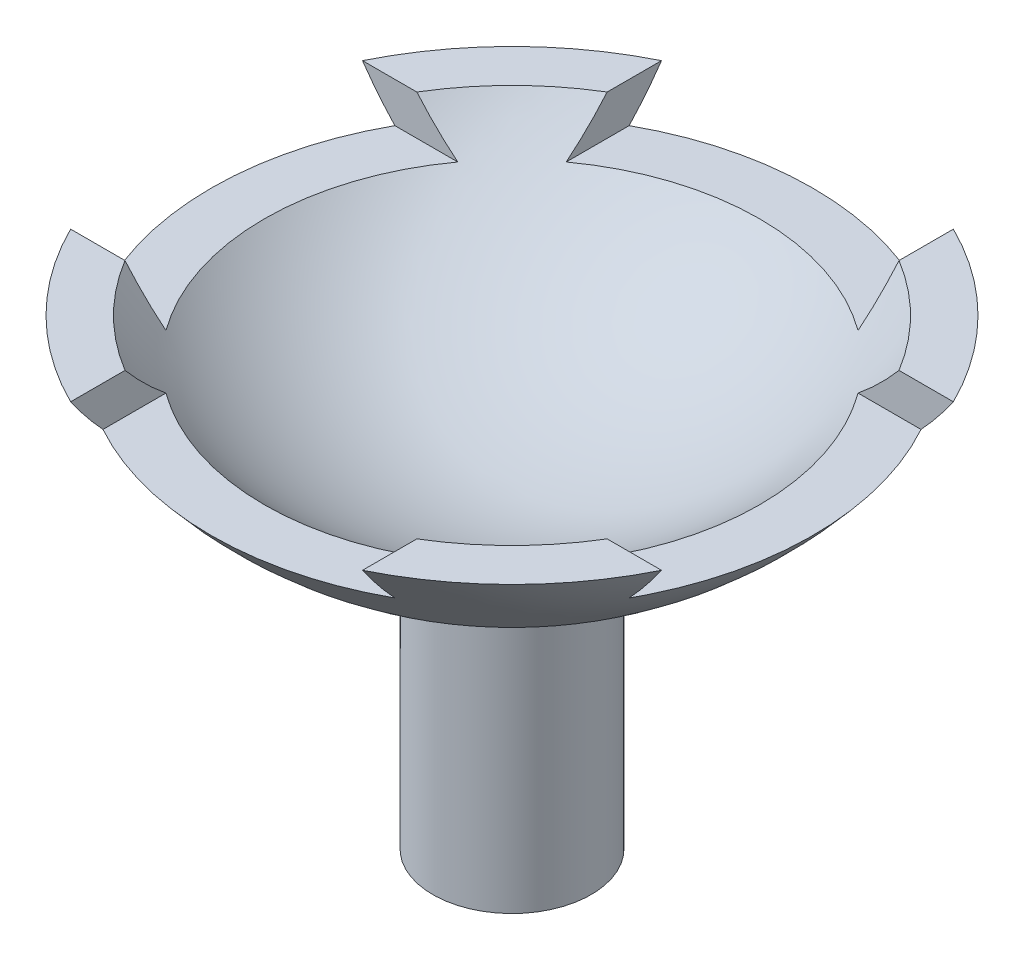
ISO-10303-21;
HEADER;
FILE_DESCRIPTION(('STEP AP214'),'2;1');
FILE_NAME('part.step','',(''),(''),'','','');
FILE_SCHEMA(('AUTOMOTIVE_DESIGN { 1 0 10303 214 1 1 1 1 }'));
ENDSEC;
DATA;
#1=APPLICATION_CONTEXT('core data for automotive mechanical design processes');
#2=APPLICATION_PROTOCOL_DEFINITION('international standard','automotive_design',2000,#1);
#3=PRODUCT_CONTEXT('',#1,'mechanical');
#4=PRODUCT('Part','Part','',(#3));
#5=PRODUCT_RELATED_PRODUCT_CATEGORY('part','',(#4));
#6=PRODUCT_DEFINITION_FORMATION('','',#4);
#7=PRODUCT_DEFINITION_CONTEXT('part definition',#1,'design');
#8=PRODUCT_DEFINITION('design','',#6,#7);
#9=PRODUCT_DEFINITION_SHAPE('','',#8);
#10=(LENGTH_UNIT() NAMED_UNIT(*) SI_UNIT(.MILLI.,.METRE.));
#11=(NAMED_UNIT(*) PLANE_ANGLE_UNIT() SI_UNIT($,.RADIAN.));
#12=(NAMED_UNIT(*) SI_UNIT($,.STERADIAN.) SOLID_ANGLE_UNIT());
#13=UNCERTAINTY_MEASURE_WITH_UNIT(LENGTH_MEASURE(1.E-05),#10,'distance_accuracy_value','');
#14=(GEOMETRIC_REPRESENTATION_CONTEXT(3) GLOBAL_UNCERTAINTY_ASSIGNED_CONTEXT((#13)) GLOBAL_UNIT_ASSIGNED_CONTEXT((#10,
#11,#12)) REPRESENTATION_CONTEXT('',''));
#15=CARTESIAN_POINT('',(0.,0.,0.));
#16=DIRECTION('',(0.,0.,1.));
#17=DIRECTION('',(1.,0.,0.));
#18=AXIS2_PLACEMENT_3D('',#15,#16,#17);
#19=CARTESIAN_POINT('',(21.3480786758773,35.,0.));
#20=DIRECTION('',(0.,-1.,0.));
#21=DIRECTION('',(1.,0.,0.));
#22=AXIS2_PLACEMENT_3D('',#19,#20,#21);
#23=PLANE('',#22);
#24=CARTESIAN_POINT('',(0.,35.,0.));
#25=DIRECTION('',(0.,1.,0.));
#26=DIRECTION('',(-1.,0.,0.));
#27=AXIS2_PLACEMENT_3D('',#24,#25,#26);
#28=CIRCLE('',#27,21.3480786758774);
#29=CARTESIAN_POINT('',(-18.2627335892371,35.,11.055));
#30=VERTEX_POINT('',#29);
#31=CARTESIAN_POINT('',(-11.055,35.,18.2627335892371));
#32=VERTEX_POINT('',#31);
#33=EDGE_CURVE('E268',#30,#32,#28,.T.);
#34=ORIENTED_EDGE('',*,*,#33,.F.);
#35=DIRECTION('',(1.,0.,0.));
#36=VECTOR('',#35,1.);
#37=CARTESIAN_POINT('',(-24.9637815587817,35.,11.0550000000001));
#38=LINE('',#37,#36);
#39=CARTESIAN_POINT('',(-22.3814083147475,35.,11.0550000000001));
#40=VERTEX_POINT('',#39);
#41=EDGE_CURVE('E171',#40,#30,#38,.T.);
#42=ORIENTED_EDGE('',*,*,#41,.F.);
#43=CARTESIAN_POINT('',(0.,35.,0.));
#44=DIRECTION('',(0.,1.,0.));
#45=DIRECTION('',(-1.,0.,0.));
#46=AXIS2_PLACEMENT_3D('',#43,#44,#45);
#47=CIRCLE('',#46,24.9627815587816);
#48=CARTESIAN_POINT('',(-11.055,35.,22.3814083147475));
#49=VERTEX_POINT('',#48);
#50=EDGE_CURVE('E177',#40,#49,#47,.T.);
#51=ORIENTED_EDGE('',*,*,#50,.T.);
#52=DIRECTION('',(0.,0.,-1.));
#53=VECTOR('',#52,1.);
#54=CARTESIAN_POINT('',(-11.055,35.,24.9637815587816));
#55=LINE('',#54,#53);
#56=EDGE_CURVE('E207',#49,#32,#55,.T.);
#57=ORIENTED_EDGE('',*,*,#56,.T.);
#58=EDGE_LOOP('',(#34,#42,#51,#57));
#59=FACE_BOUND('',#58,.T.);
#60=ADVANCED_FACE('F39',(#59),#23,.F.);
#61=CARTESIAN_POINT('',(11.055,35.,18.2627335892371));
#62=VERTEX_POINT('',#61);
#63=CARTESIAN_POINT('',(18.2627335892372,35.,11.0549999999998));
#64=VERTEX_POINT('',#63);
#65=EDGE_CURVE('E325',#62,#64,#28,.T.);
#66=ORIENTED_EDGE('',*,*,#65,.F.);
#67=DIRECTION('',(0.,0.,-1.));
#68=VECTOR('',#67,1.);
#69=CARTESIAN_POINT('',(11.055,35.,24.9637815587816));
#70=LINE('',#69,#68);
#71=CARTESIAN_POINT('',(11.055,35.,22.3814083147475));
#72=VERTEX_POINT('',#71);
#73=EDGE_CURVE('E204',#72,#62,#70,.T.);
#74=ORIENTED_EDGE('',*,*,#73,.F.);
#75=CARTESIAN_POINT('',(22.3814083147476,35.,11.0549999999998));
#76=VERTEX_POINT('',#75);
#77=EDGE_CURVE('E340',#72,#76,#47,.T.);
#78=ORIENTED_EDGE('',*,*,#77,.T.);
#79=DIRECTION('',(-1.,0.,0.));
#80=VECTOR('',#79,1.);
#81=CARTESIAN_POINT('',(24.963781558782,35.,11.0549999999998));
#82=LINE('',#81,#80);
#83=EDGE_CURVE('E229',#76,#64,#82,.T.);
#84=ORIENTED_EDGE('',*,*,#83,.T.);
#85=EDGE_LOOP('',(#66,#74,#78,#84));
#86=FACE_BOUND('',#85,.T.);
#87=ADVANCED_FACE('F288',(#86),#23,.F.);
#88=CARTESIAN_POINT('',(18.262733589237,35.,-11.0550000000002));
#89=VERTEX_POINT('',#88);
#90=CARTESIAN_POINT('',(11.055,35.,-18.2627335892371));
#91=VERTEX_POINT('',#90);
#92=EDGE_CURVE('E263',#89,#91,#28,.T.);
#93=ORIENTED_EDGE('',*,*,#92,.F.);
#94=DIRECTION('',(-1.,0.,0.));
#95=VECTOR('',#94,1.);
#96=CARTESIAN_POINT('',(24.9637815587818,35.,-11.0550000000002));
#97=LINE('',#96,#95);
#98=CARTESIAN_POINT('',(22.3814083147474,35.,-11.0550000000002));
#99=VERTEX_POINT('',#98);
#100=EDGE_CURVE('E226',#99,#89,#97,.T.);
#101=ORIENTED_EDGE('',*,*,#100,.F.);
#102=CARTESIAN_POINT('',(11.055,35.,-22.3814083147475));
#103=VERTEX_POINT('',#102);
#104=EDGE_CURVE('E267',#99,#103,#47,.T.);
#105=ORIENTED_EDGE('',*,*,#104,.T.);
#106=DIRECTION('',(0.,0.,1.));
#107=VECTOR('',#106,1.);
#108=CARTESIAN_POINT('',(11.055,35.,-24.9637815587816));
#109=LINE('',#108,#107);
#110=EDGE_CURVE('E252',#103,#91,#109,.T.);
#111=ORIENTED_EDGE('',*,*,#110,.T.);
#112=EDGE_LOOP('',(#93,#101,#105,#111));
#113=FACE_BOUND('',#112,.T.);
#114=ADVANCED_FACE('F296',(#113),#23,.F.);
#115=CARTESIAN_POINT('',(0.,50.5312438925075,0.));
#116=DIRECTION('',(0.,1.,0.));
#117=DIRECTION('',(1.,0.,0.));
#118=AXIS2_PLACEMENT_3D('',#115,#116,#117);
#119=SPHERICAL_SURFACE('',#118,26.4);
#120=CARTESIAN_POINT('',(0.,31.96,0.));
#121=DIRECTION('',(0.,-1.,0.));
#122=DIRECTION('',(1.,0.,0.));
#123=AXIS2_PLACEMENT_3D('',#120,#121,#122);
#124=CIRCLE('',#123,18.7634991482134);
#125=CARTESIAN_POINT('',(-15.1609984923488,31.96,11.055));
#126=VERTEX_POINT('',#125);
#127=CARTESIAN_POINT('',(-15.1609984923489,31.96,-11.055));
#128=VERTEX_POINT('',#127);
#129=EDGE_CURVE('E170',#126,#128,#124,.T.);
#130=ORIENTED_EDGE('',*,*,#129,.F.);
#131=CARTESIAN_POINT('',(0.,50.5312438925075,11.055));
#132=DIRECTION('',(0.,0.,1.));
#133=DIRECTION('',(1.,0.,0.));
#134=AXIS2_PLACEMENT_3D('',#131,#132,#133);
#135=CIRCLE('',#134,23.9738811000639);
#136=EDGE_CURVE('E158',#30,#126,#135,.T.);
#137=ORIENTED_EDGE('',*,*,#136,.F.);
#138=ORIENTED_EDGE('',*,*,#33,.T.);
#139=CARTESIAN_POINT('',(-11.055,50.5312438925075,0.));
#140=DIRECTION('',(-1.,0.,0.));
#141=DIRECTION('',(0.,-1.,0.));
#142=AXIS2_PLACEMENT_3D('',#139,#140,#141);
#143=CIRCLE('',#142,23.9738811000639);
#144=CARTESIAN_POINT('',(-11.055,31.96,15.1609984923488));
#145=VERTEX_POINT('',#144);
#146=EDGE_CURVE('E62',#145,#32,#143,.T.);
#147=ORIENTED_EDGE('',*,*,#146,.F.);
#148=CARTESIAN_POINT('',(0.,31.96,0.));
#149=DIRECTION('',(0.,-1.,0.));
#150=DIRECTION('',(1.,0.,0.));
#151=AXIS2_PLACEMENT_3D('',#148,#149,#150);
#152=CIRCLE('',#151,18.7634991482134);
#153=CARTESIAN_POINT('',(11.055,31.96,15.1609984923489));
#154=VERTEX_POINT('',#153);
#155=EDGE_CURVE('E182',#154,#145,#152,.T.);
#156=ORIENTED_EDGE('',*,*,#155,.F.);
#157=CARTESIAN_POINT('',(11.055,50.5312438925075,0.));
#158=DIRECTION('',(1.,0.,0.));
#159=DIRECTION('',(0.,1.,0.));
#160=AXIS2_PLACEMENT_3D('',#157,#158,#159);
#161=CIRCLE('',#160,23.9738811000639);
#162=EDGE_CURVE('E200',#62,#154,#161,.T.);
#163=ORIENTED_EDGE('',*,*,#162,.F.);
#164=ORIENTED_EDGE('',*,*,#65,.T.);
#165=CARTESIAN_POINT('',(1.12325531650779E-13,50.5312438925075,11.055));
#166=DIRECTION('',(0.,0.,1.));
#167=DIRECTION('',(1.,0.,0.));
#168=AXIS2_PLACEMENT_3D('',#165,#166,#167);
#169=CIRCLE('',#168,23.9738811000639);
#170=CARTESIAN_POINT('',(15.1609984923489,31.96,11.0549999999999));
#171=VERTEX_POINT('',#170);
#172=EDGE_CURVE('E54',#171,#64,#169,.T.);
#173=ORIENTED_EDGE('',*,*,#172,.F.);
#174=CARTESIAN_POINT('',(0.,31.96,0.));
#175=DIRECTION('',(0.,-1.,0.));
#176=DIRECTION('',(0.,0.,-1.));
#177=AXIS2_PLACEMENT_3D('',#174,#175,#176);
#178=CIRCLE('',#177,18.7634991482134);
#179=CARTESIAN_POINT('',(15.1609984923487,31.96,-11.0550000000001));
#180=VERTEX_POINT('',#179);
#181=EDGE_CURVE('E197',#180,#171,#178,.T.);
#182=ORIENTED_EDGE('',*,*,#181,.F.);
#183=CARTESIAN_POINT('',(-1.19264425554686E-13,50.5312438925075,-11.055));
#184=DIRECTION('',(0.,0.,-1.));
#185=DIRECTION('',(-1.,0.,0.));
#186=AXIS2_PLACEMENT_3D('',#183,#184,#185);
#187=CIRCLE('',#186,23.9738811000639);
#188=EDGE_CURVE('E222',#89,#180,#187,.T.);
#189=ORIENTED_EDGE('',*,*,#188,.F.);
#190=ORIENTED_EDGE('',*,*,#92,.T.);
#191=CARTESIAN_POINT('',(11.055,50.5312438925075,0.));
#192=DIRECTION('',(1.,0.,0.));
#193=DIRECTION('',(0.,0.,-1.));
#194=AXIS2_PLACEMENT_3D('',#191,#192,#193);
#195=CIRCLE('',#194,23.9738811000639);
#196=CARTESIAN_POINT('',(11.055,31.96,-15.1609984923488));
#197=VERTEX_POINT('',#196);
#198=EDGE_CURVE('E242',#197,#91,#195,.T.);
#199=ORIENTED_EDGE('',*,*,#198,.F.);
#200=CARTESIAN_POINT('',(0.,31.96,0.));
#201=DIRECTION('',(0.,-1.,0.));
#202=DIRECTION('',(0.,0.,-1.));
#203=AXIS2_PLACEMENT_3D('',#200,#201,#202);
#204=CIRCLE('',#203,18.7634991482134);
#205=CARTESIAN_POINT('',(-11.055,31.96,-15.1609984923488));
#206=VERTEX_POINT('',#205);
#207=EDGE_CURVE('E260',#206,#197,#204,.T.);
#208=ORIENTED_EDGE('',*,*,#207,.F.);
#209=CARTESIAN_POINT('',(-11.055,50.5312438925075,0.));
#210=DIRECTION('',(-1.,0.,0.));
#211=DIRECTION('',(0.,0.,1.));
#212=AXIS2_PLACEMENT_3D('',#209,#210,#211);
#213=CIRCLE('',#212,23.9738811000639);
#214=CARTESIAN_POINT('',(-11.055,35.,-18.2627335892371));
#215=VERTEX_POINT('',#214);
#216=EDGE_CURVE('E245',#215,#206,#213,.T.);
#217=ORIENTED_EDGE('',*,*,#216,.F.);
#218=CARTESIAN_POINT('',(-18.2627335892372,35.,-11.055));
#219=VERTEX_POINT('',#218);
#220=EDGE_CURVE('E264',#215,#219,#28,.T.);
#221=ORIENTED_EDGE('',*,*,#220,.T.);
#222=CARTESIAN_POINT('',(0.,50.5312438925075,-11.055));
#223=DIRECTION('',(0.,0.,-1.));
#224=DIRECTION('',(-1.,0.,0.));
#225=AXIS2_PLACEMENT_3D('',#222,#223,#224);
#226=CIRCLE('',#225,23.9738811000639);
#227=EDGE_CURVE('E178',#128,#219,#226,.T.);
#228=ORIENTED_EDGE('',*,*,#227,.F.);
#229=EDGE_LOOP('',(#130,#137,#138,#147,#156,#163,#164,#173,#182,#189,#190,#199,#208,#217,#221,#228));
#230=FACE_BOUND('',#229,.T.);
#231=ADVANCED_FACE('F313',(#230),#119,.F.);
#232=CARTESIAN_POINT('',(6.,0.,0.));
#233=DIRECTION('',(0.,1.,0.));
#234=DIRECTION('',(-1.,0.,0.));
#235=AXIS2_PLACEMENT_3D('',#232,#233,#234);
#236=PLANE('',#235);
#237=CARTESIAN_POINT('',(0.,0.,0.));
#238=DIRECTION('',(0.,1.,0.));
#239=DIRECTION('',(-1.,0.,0.));
#240=AXIS2_PLACEMENT_3D('',#237,#238,#239);
#241=CIRCLE('',#240,6.);
#242=CARTESIAN_POINT('',(-6.,0.,0.));
#243=VERTEX_POINT('',#242);
#244=EDGE_CURVE('E272',#243,#243,#241,.T.);
#245=ORIENTED_EDGE('',*,*,#244,.F.);
#246=EDGE_LOOP('',(#245));
#247=FACE_BOUND('',#246,.T.);
#248=ADVANCED_FACE('F317',(#247),#236,.F.);
#249=CARTESIAN_POINT('',(0.,24.1312438925075,0.));
#250=DIRECTION('',(0.,1.,0.));
#251=DIRECTION('',(-1.,0.,0.));
#252=AXIS2_PLACEMENT_3D('',#249,#250,#251);
#253=CYLINDRICAL_SURFACE('',#252,6.);
#254=CARTESIAN_POINT('',(0.,20.5552535001952,0.));
#255=DIRECTION('',(0.,1.,0.));
#256=DIRECTION('',(-1.,0.,0.));
#257=AXIS2_PLACEMENT_3D('',#254,#255,#256);
#258=CIRCLE('',#257,6.);
#259=CARTESIAN_POINT('',(-6.00000000000001,20.5552535001952,0.));
#260=VERTEX_POINT('',#259);
#261=EDGE_CURVE('E11',#260,#260,#258,.F.);
#262=ORIENTED_EDGE('',*,*,#261,.T.);
#263=EDGE_LOOP('',(#262));
#264=FACE_BOUND('',#263,.T.);
#265=ORIENTED_EDGE('',*,*,#244,.T.);
#266=EDGE_LOOP('',(#265));
#267=FACE_BOUND('',#266,.T.);
#268=ADVANCED_FACE('F311',(#264,#267),#253,.T.);
#269=CARTESIAN_POINT('',(0.,50.5312438925075,0.));
#270=DIRECTION('',(0.,1.,0.));
#271=DIRECTION('',(1.,0.,0.));
#272=AXIS2_PLACEMENT_3D('',#269,#270,#271);
#273=SPHERICAL_SURFACE('',#272,29.4);
#274=CARTESIAN_POINT('',(0.,22.0103986648705,0.));
#275=DIRECTION('',(0.,1.,0.));
#276=DIRECTION('',(-1.,0.,0.));
#277=AXIS2_PLACEMENT_3D('',#274,#275,#276);
#278=CIRCLE('',#277,7.13592233009709);
#279=CARTESIAN_POINT('',(-7.13592233009708,22.0103986648705,0.));
#280=VERTEX_POINT('',#279);
#281=EDGE_CURVE('E47',#280,#280,#278,.T.);
#282=ORIENTED_EDGE('',*,*,#281,.T.);
#283=EDGE_LOOP('',(#282));
#284=FACE_BOUND('',#283,.T.);
#285=ORIENTED_EDGE('',*,*,#50,.F.);
#286=CARTESIAN_POINT('',(0.,50.5312438925075,11.055));
#287=DIRECTION('',(0.,0.,1.));
#288=DIRECTION('',(1.,0.,0.));
#289=AXIS2_PLACEMENT_3D('',#286,#287,#288);
#290=CIRCLE('',#289,27.2423746211669);
#291=CARTESIAN_POINT('',(-19.9312788171006,31.96,11.0550000000001));
#292=VERTEX_POINT('',#291);
#293=EDGE_CURVE('E155',#292,#40,#290,.F.);
#294=ORIENTED_EDGE('',*,*,#293,.F.);
#295=CARTESIAN_POINT('',(0.,31.96,0.));
#296=DIRECTION('',(0.,-1.,0.));
#297=DIRECTION('',(1.,0.,0.));
#298=AXIS2_PLACEMENT_3D('',#295,#296,#297);
#299=CIRCLE('',#298,22.7918603954351);
#300=CARTESIAN_POINT('',(-19.9312788171006,31.96,-11.0549999999999));
#301=VERTEX_POINT('',#300);
#302=EDGE_CURVE('E165',#301,#292,#299,.F.);
#303=ORIENTED_EDGE('',*,*,#302,.F.);
#304=CARTESIAN_POINT('',(0.,50.5312438925075,-11.055));
#305=DIRECTION('',(0.,0.,-1.));
#306=DIRECTION('',(-1.,0.,0.));
#307=AXIS2_PLACEMENT_3D('',#304,#305,#306);
#308=CIRCLE('',#307,27.2423746211669);
#309=CARTESIAN_POINT('',(-22.3814083147476,35.,-11.0549999999999));
#310=VERTEX_POINT('',#309);
#311=EDGE_CURVE('E179',#310,#301,#308,.F.);
#312=ORIENTED_EDGE('',*,*,#311,.F.);
#313=CARTESIAN_POINT('',(-11.055,35.,-22.3814083147475));
#314=VERTEX_POINT('',#313);
#315=EDGE_CURVE('E269',#314,#310,#47,.T.);
#316=ORIENTED_EDGE('',*,*,#315,.F.);
#317=CARTESIAN_POINT('',(-11.055,50.5312438925075,0.));
#318=DIRECTION('',(-1.,0.,0.));
#319=DIRECTION('',(0.,0.,1.));
#320=AXIS2_PLACEMENT_3D('',#317,#318,#319);
#321=CIRCLE('',#320,27.2423746211669);
#322=CARTESIAN_POINT('',(-11.055,31.96,-19.9312788171006));
#323=VERTEX_POINT('',#322);
#324=EDGE_CURVE('E240',#323,#314,#321,.F.);
#325=ORIENTED_EDGE('',*,*,#324,.F.);
#326=CARTESIAN_POINT('',(0.,31.96,0.));
#327=DIRECTION('',(0.,-1.,0.));
#328=DIRECTION('',(0.,0.,-1.));
#329=AXIS2_PLACEMENT_3D('',#326,#327,#328);
#330=CIRCLE('',#329,22.7918603954351);
#331=CARTESIAN_POINT('',(11.055,31.96,-19.9312788171006));
#332=VERTEX_POINT('',#331);
#333=EDGE_CURVE('E251',#332,#323,#330,.F.);
#334=ORIENTED_EDGE('',*,*,#333,.F.);
#335=CARTESIAN_POINT('',(11.055,50.5312438925075,0.));
#336=DIRECTION('',(1.,0.,0.));
#337=DIRECTION('',(0.,0.,-1.));
#338=AXIS2_PLACEMENT_3D('',#335,#336,#337);
#339=CIRCLE('',#338,27.2423746211669);
#340=EDGE_CURVE('E192',#103,#332,#339,.F.);
#341=ORIENTED_EDGE('',*,*,#340,.F.);
#342=ORIENTED_EDGE('',*,*,#104,.F.);
#343=CARTESIAN_POINT('',(-1.19264425554686E-13,50.5312438925075,-11.055));
#344=DIRECTION('',(0.,0.,-1.));
#345=DIRECTION('',(-1.,0.,0.));
#346=AXIS2_PLACEMENT_3D('',#343,#344,#345);
#347=CIRCLE('',#346,27.2423746211669);
#348=CARTESIAN_POINT('',(19.9312788171005,31.96,-11.0550000000002));
#349=VERTEX_POINT('',#348);
#350=EDGE_CURVE('E219',#349,#99,#347,.F.);
#351=ORIENTED_EDGE('',*,*,#350,.F.);
#352=CARTESIAN_POINT('',(0.,31.96,0.));
#353=DIRECTION('',(0.,-1.,0.));
#354=DIRECTION('',(0.,0.,-1.));
#355=AXIS2_PLACEMENT_3D('',#352,#353,#354);
#356=CIRCLE('',#355,22.7918603954351);
#357=CARTESIAN_POINT('',(19.9312788171007,31.96,11.0549999999998));
#358=VERTEX_POINT('',#357);
#359=EDGE_CURVE('E228',#358,#349,#356,.F.);
#360=ORIENTED_EDGE('',*,*,#359,.F.);
#361=CARTESIAN_POINT('',(1.12325531650779E-13,50.5312438925075,11.055));
#362=DIRECTION('',(0.,0.,1.));
#363=DIRECTION('',(1.,0.,0.));
#364=AXIS2_PLACEMENT_3D('',#361,#362,#363);
#365=CIRCLE('',#364,27.2423746211669);
#366=EDGE_CURVE('E216',#76,#358,#365,.F.);
#367=ORIENTED_EDGE('',*,*,#366,.F.);
#368=ORIENTED_EDGE('',*,*,#77,.F.);
#369=CARTESIAN_POINT('',(11.055,50.5312438925075,0.));
#370=DIRECTION('',(1.,0.,0.));
#371=DIRECTION('',(0.,1.,0.));
#372=AXIS2_PLACEMENT_3D('',#369,#370,#371);
#373=CIRCLE('',#372,27.2423746211669);
#374=CARTESIAN_POINT('',(11.055,31.96,19.9312788171006));
#375=VERTEX_POINT('',#374);
#376=EDGE_CURVE('E196',#375,#72,#373,.F.);
#377=ORIENTED_EDGE('',*,*,#376,.F.);
#378=CARTESIAN_POINT('',(0.,31.96,0.));
#379=DIRECTION('',(0.,-1.,0.));
#380=DIRECTION('',(1.,0.,0.));
#381=AXIS2_PLACEMENT_3D('',#378,#379,#380);
#382=CIRCLE('',#381,22.7918603954351);
#383=CARTESIAN_POINT('',(-11.055,31.96,19.9312788171006));
#384=VERTEX_POINT('',#383);
#385=EDGE_CURVE('E206',#384,#375,#382,.F.);
#386=ORIENTED_EDGE('',*,*,#385,.F.);
#387=CARTESIAN_POINT('',(-11.055,50.5312438925075,0.));
#388=DIRECTION('',(-1.,0.,0.));
#389=DIRECTION('',(0.,-1.,0.));
#390=AXIS2_PLACEMENT_3D('',#387,#388,#389);
#391=CIRCLE('',#390,27.2423746211669);
#392=EDGE_CURVE('E193',#49,#384,#391,.F.);
#393=ORIENTED_EDGE('',*,*,#392,.F.);
#394=EDGE_LOOP('',(#285,#294,#303,#312,#316,#325,#334,#341,#342,#351,#360,#367,#368,#377,#386,#393));
#395=FACE_BOUND('',#394,.T.);
#396=ADVANCED_FACE('F174',(#284,#395),#273,.T.);
#397=ORIENTED_EDGE('',*,*,#315,.T.);
#398=DIRECTION('',(1.,0.,0.));
#399=VECTOR('',#398,1.);
#400=CARTESIAN_POINT('',(-24.9637815587818,35.,-11.0549999999999));
#401=LINE('',#400,#399);
#402=EDGE_CURVE('E187',#310,#219,#401,.T.);
#403=ORIENTED_EDGE('',*,*,#402,.T.);
#404=ORIENTED_EDGE('',*,*,#220,.F.);
#405=DIRECTION('',(0.,0.,1.));
#406=VECTOR('',#405,1.);
#407=CARTESIAN_POINT('',(-11.055,35.,-24.9637815587816));
#408=LINE('',#407,#406);
#409=EDGE_CURVE('E249',#314,#215,#408,.T.);
#410=ORIENTED_EDGE('',*,*,#409,.F.);
#411=EDGE_LOOP('',(#397,#403,#404,#410));
#412=FACE_BOUND('',#411,.T.);
#413=ADVANCED_FACE('F291',(#412),#23,.F.);
#414=CARTESIAN_POINT('',(-11.055,35.,-24.9637815587816));
#415=DIRECTION('',(-1.,0.,0.));
#416=DIRECTION('',(0.,0.,1.));
#417=AXIS2_PLACEMENT_3D('',#414,#415,#416);
#418=PLANE('',#417);
#419=ORIENTED_EDGE('',*,*,#216,.T.);
#420=DIRECTION('',(0.,0.,1.));
#421=VECTOR('',#420,1.);
#422=CARTESIAN_POINT('',(-11.055,31.96,-24.9637815587816));
#423=LINE('',#422,#421);
#424=EDGE_CURVE('E248',#323,#206,#423,.T.);
#425=ORIENTED_EDGE('',*,*,#424,.F.);
#426=ORIENTED_EDGE('',*,*,#324,.T.);
#427=ORIENTED_EDGE('',*,*,#409,.T.);
#428=EDGE_LOOP('',(#419,#425,#426,#427));
#429=FACE_BOUND('',#428,.T.);
#430=ADVANCED_FACE('F302',(#429),#418,.F.);
#431=CARTESIAN_POINT('',(11.055,35.,-24.9637815587816));
#432=DIRECTION('',(1.,0.,0.));
#433=DIRECTION('',(0.,0.,-1.));
#434=AXIS2_PLACEMENT_3D('',#431,#432,#433);
#435=PLANE('',#434);
#436=ORIENTED_EDGE('',*,*,#198,.T.);
#437=ORIENTED_EDGE('',*,*,#110,.F.);
#438=ORIENTED_EDGE('',*,*,#340,.T.);
#439=DIRECTION('',(0.,0.,1.));
#440=VECTOR('',#439,1.);
#441=CARTESIAN_POINT('',(11.055,31.96,-24.9637815587816));
#442=LINE('',#441,#440);
#443=EDGE_CURVE('E255',#332,#197,#442,.T.);
#444=ORIENTED_EDGE('',*,*,#443,.T.);
#445=EDGE_LOOP('',(#436,#437,#438,#444));
#446=FACE_BOUND('',#445,.T.);
#447=ADVANCED_FACE('F309',(#446),#435,.F.);
#448=CARTESIAN_POINT('',(-11.055,31.96,-24.9637815587816));
#449=DIRECTION('',(0.,-1.,0.));
#450=DIRECTION('',(0.,0.,-1.));
#451=AXIS2_PLACEMENT_3D('',#448,#449,#450);
#452=PLANE('',#451);
#453=ORIENTED_EDGE('',*,*,#207,.T.);
#454=ORIENTED_EDGE('',*,*,#443,.F.);
#455=ORIENTED_EDGE('',*,*,#333,.T.);
#456=ORIENTED_EDGE('',*,*,#424,.T.);
#457=EDGE_LOOP('',(#453,#454,#455,#456));
#458=FACE_BOUND('',#457,.T.);
#459=ADVANCED_FACE('F350',(#458),#452,.F.);
#460=CARTESIAN_POINT('',(24.9637815587818,35.,-11.0550000000002));
#461=DIRECTION('',(0.,0.,-1.));
#462=DIRECTION('',(-1.,0.,0.));
#463=AXIS2_PLACEMENT_3D('',#460,#461,#462);
#464=PLANE('',#463);
#465=ORIENTED_EDGE('',*,*,#188,.T.);
#466=DIRECTION('',(-1.,0.,0.));
#467=VECTOR('',#466,1.);
#468=CARTESIAN_POINT('',(24.9637815587818,31.96,-11.0550000000002));
#469=LINE('',#468,#467);
#470=EDGE_CURVE('E225',#349,#180,#469,.T.);
#471=ORIENTED_EDGE('',*,*,#470,.F.);
#472=ORIENTED_EDGE('',*,*,#350,.T.);
#473=ORIENTED_EDGE('',*,*,#100,.T.);
#474=EDGE_LOOP('',(#465,#471,#472,#473));
#475=FACE_BOUND('',#474,.T.);
#476=ADVANCED_FACE('F349',(#475),#464,.F.);
#477=CARTESIAN_POINT('',(24.963781558782,35.,11.0549999999998));
#478=DIRECTION('',(0.,0.,1.));
#479=DIRECTION('',(1.,0.,0.));
#480=AXIS2_PLACEMENT_3D('',#477,#478,#479);
#481=PLANE('',#480);
#482=ORIENTED_EDGE('',*,*,#172,.T.);
#483=ORIENTED_EDGE('',*,*,#83,.F.);
#484=ORIENTED_EDGE('',*,*,#366,.T.);
#485=DIRECTION('',(-1.,0.,0.));
#486=VECTOR('',#485,1.);
#487=CARTESIAN_POINT('',(24.963781558782,31.96,11.0549999999998));
#488=LINE('',#487,#486);
#489=EDGE_CURVE('E231',#358,#171,#488,.T.);
#490=ORIENTED_EDGE('',*,*,#489,.T.);
#491=EDGE_LOOP('',(#482,#483,#484,#490));
#492=FACE_BOUND('',#491,.T.);
#493=ADVANCED_FACE('F342',(#492),#481,.F.);
#494=CARTESIAN_POINT('',(24.9637815587818,31.96,-11.0550000000002));
#495=DIRECTION('',(0.,-1.,0.));
#496=DIRECTION('',(0.,0.,-1.));
#497=AXIS2_PLACEMENT_3D('',#494,#495,#496);
#498=PLANE('',#497);
#499=ORIENTED_EDGE('',*,*,#181,.T.);
#500=ORIENTED_EDGE('',*,*,#489,.F.);
#501=ORIENTED_EDGE('',*,*,#359,.T.);
#502=ORIENTED_EDGE('',*,*,#470,.T.);
#503=EDGE_LOOP('',(#499,#500,#501,#502));
#504=FACE_BOUND('',#503,.T.);
#505=ADVANCED_FACE('F346',(#504),#498,.F.);
#506=CARTESIAN_POINT('',(11.055,35.,24.9637815587816));
#507=DIRECTION('',(1.,0.,0.));
#508=DIRECTION('',(0.,1.,0.));
#509=AXIS2_PLACEMENT_3D('',#506,#507,#508);
#510=PLANE('',#509);
#511=ORIENTED_EDGE('',*,*,#162,.T.);
#512=DIRECTION('',(0.,0.,-1.));
#513=VECTOR('',#512,1.);
#514=CARTESIAN_POINT('',(11.055,31.96,24.9637815587816));
#515=LINE('',#514,#513);
#516=EDGE_CURVE('E203',#375,#154,#515,.T.);
#517=ORIENTED_EDGE('',*,*,#516,.F.);
#518=ORIENTED_EDGE('',*,*,#376,.T.);
#519=ORIENTED_EDGE('',*,*,#73,.T.);
#520=EDGE_LOOP('',(#511,#517,#518,#519));
#521=FACE_BOUND('',#520,.T.);
#522=ADVANCED_FACE('F383',(#521),#510,.F.);
#523=CARTESIAN_POINT('',(-11.055,35.,24.9637815587816));
#524=DIRECTION('',(-1.,0.,0.));
#525=DIRECTION('',(0.,-1.,0.));
#526=AXIS2_PLACEMENT_3D('',#523,#524,#525);
#527=PLANE('',#526);
#528=ORIENTED_EDGE('',*,*,#146,.T.);
#529=ORIENTED_EDGE('',*,*,#56,.F.);
#530=ORIENTED_EDGE('',*,*,#392,.T.);
#531=DIRECTION('',(0.,0.,-1.));
#532=VECTOR('',#531,1.);
#533=CARTESIAN_POINT('',(-11.055,31.96,24.9637815587816));
#534=LINE('',#533,#532);
#535=EDGE_CURVE('E209',#384,#145,#534,.T.);
#536=ORIENTED_EDGE('',*,*,#535,.T.);
#537=EDGE_LOOP('',(#528,#529,#530,#536));
#538=FACE_BOUND('',#537,.T.);
#539=ADVANCED_FACE('F331',(#538),#527,.F.);
#540=CARTESIAN_POINT('',(11.055,31.96,24.9637815587816));
#541=DIRECTION('',(0.,-1.,0.));
#542=DIRECTION('',(1.,0.,0.));
#543=AXIS2_PLACEMENT_3D('',#540,#541,#542);
#544=PLANE('',#543);
#545=ORIENTED_EDGE('',*,*,#155,.T.);
#546=ORIENTED_EDGE('',*,*,#535,.F.);
#547=ORIENTED_EDGE('',*,*,#385,.T.);
#548=ORIENTED_EDGE('',*,*,#516,.T.);
#549=EDGE_LOOP('',(#545,#546,#547,#548));
#550=FACE_BOUND('',#549,.T.);
#551=ADVANCED_FACE('F336',(#550),#544,.F.);
#552=CARTESIAN_POINT('',(-24.9637815587817,35.,11.0550000000001));
#553=DIRECTION('',(0.,0.,1.));
#554=DIRECTION('',(1.,0.,0.));
#555=AXIS2_PLACEMENT_3D('',#552,#553,#554);
#556=PLANE('',#555);
#557=ORIENTED_EDGE('',*,*,#136,.T.);
#558=DIRECTION('',(1.,0.,0.));
#559=VECTOR('',#558,1.);
#560=CARTESIAN_POINT('',(-24.9637815587817,31.96,11.0550000000001));
#561=LINE('',#560,#559);
#562=EDGE_CURVE('E151',#292,#126,#561,.T.);
#563=ORIENTED_EDGE('',*,*,#562,.F.);
#564=ORIENTED_EDGE('',*,*,#293,.T.);
#565=ORIENTED_EDGE('',*,*,#41,.T.);
#566=EDGE_LOOP('',(#557,#563,#564,#565));
#567=FACE_BOUND('',#566,.T.);
#568=ADVANCED_FACE('F153',(#567),#556,.F.);
#569=CARTESIAN_POINT('',(-24.9637815587818,35.,-11.0549999999999));
#570=DIRECTION('',(0.,0.,-1.));
#571=DIRECTION('',(-1.,0.,0.));
#572=AXIS2_PLACEMENT_3D('',#569,#570,#571);
#573=PLANE('',#572);
#574=ORIENTED_EDGE('',*,*,#227,.T.);
#575=ORIENTED_EDGE('',*,*,#402,.F.);
#576=ORIENTED_EDGE('',*,*,#311,.T.);
#577=DIRECTION('',(1.,0.,0.));
#578=VECTOR('',#577,1.);
#579=CARTESIAN_POINT('',(-24.9637815587818,31.96,-11.0549999999999));
#580=LINE('',#579,#578);
#581=EDGE_CURVE('E162',#301,#128,#580,.T.);
#582=ORIENTED_EDGE('',*,*,#581,.T.);
#583=EDGE_LOOP('',(#574,#575,#576,#582));
#584=FACE_BOUND('',#583,.T.);
#585=ADVANCED_FACE('F284',(#584),#573,.F.);
#586=CARTESIAN_POINT('',(-24.9637815587817,31.96,11.0550000000001));
#587=DIRECTION('',(0.,-1.,0.));
#588=DIRECTION('',(1.,0.,0.));
#589=AXIS2_PLACEMENT_3D('',#586,#587,#588);
#590=PLANE('',#589);
#591=ORIENTED_EDGE('',*,*,#129,.T.);
#592=ORIENTED_EDGE('',*,*,#581,.F.);
#593=ORIENTED_EDGE('',*,*,#302,.T.);
#594=ORIENTED_EDGE('',*,*,#562,.T.);
#595=EDGE_LOOP('',(#591,#592,#593,#594));
#596=FACE_BOUND('',#595,.T.);
#597=ADVANCED_FACE('F166',(#596),#590,.F.);
#598=CARTESIAN_POINT('',(0.,20.5552535001952,0.));
#599=DIRECTION('',(0.,1.,0.));
#600=DIRECTION('',(-1.,0.,0.));
#601=AXIS2_PLACEMENT_3D('',#598,#599,#600);
#602=TOROIDAL_SURFACE('',#601,7.5,1.5);
#603=ORIENTED_EDGE('',*,*,#261,.F.);
#604=EDGE_LOOP('',(#603));
#605=FACE_BOUND('',#604,.T.);
#606=ORIENTED_EDGE('',*,*,#281,.F.);
#607=EDGE_LOOP('',(#606));
#608=FACE_BOUND('',#607,.T.);
#609=ADVANCED_FACE('F41',(#605,#608),#602,.F.);
#610=CLOSED_SHELL('',(#60,#87,#114,#231,#248,#268,#396,#413,#430,#447,#459,#476,#493,#505,#522,
#539,#551,#568,#585,#597,#609));
#611=MANIFOLD_SOLID_BREP('B2',#610);
#612=ADVANCED_BREP_SHAPE_REPRESENTATION('',(#18,#611),#14);
#613=SHAPE_DEFINITION_REPRESENTATION(#9,#612);
ENDSEC;
END-ISO-10303-21;
